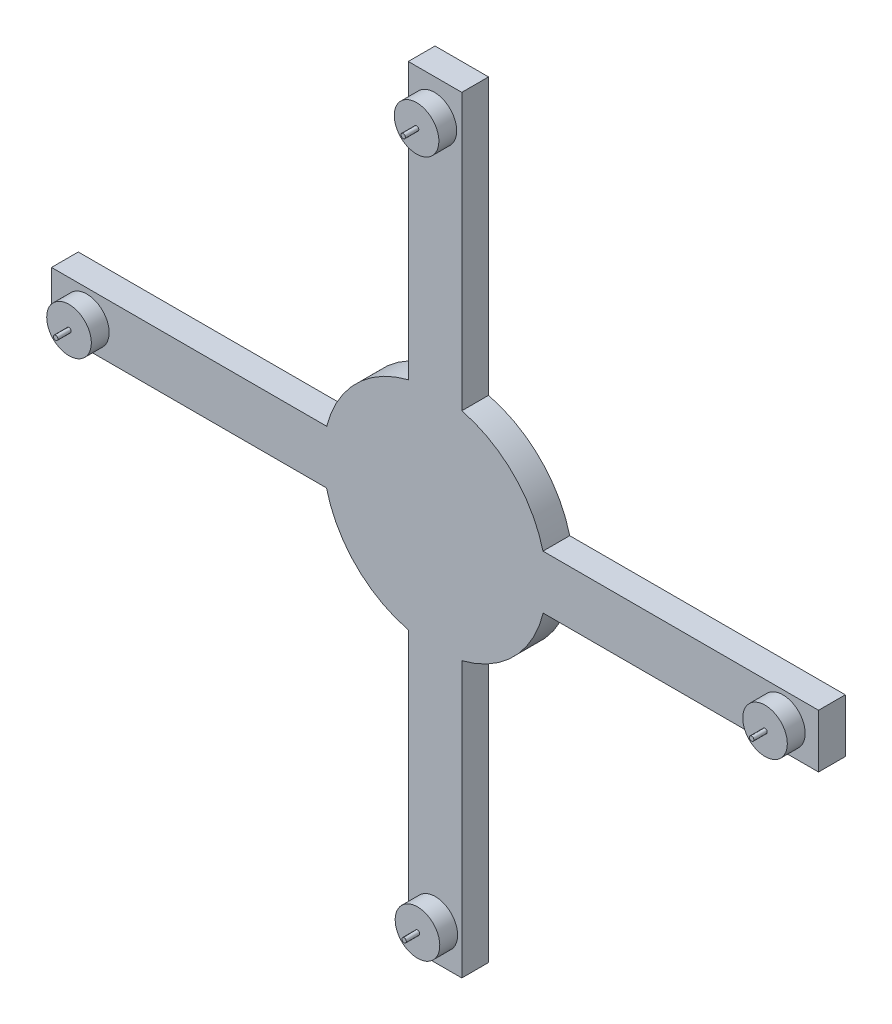
ISO-10303-21;
HEADER;
FILE_DESCRIPTION(('STEP AP214'),'2;1');
FILE_NAME('part.step','',(''),(''),'','','');
FILE_SCHEMA(('AUTOMOTIVE_DESIGN { 1 0 10303 214 1 1 1 1 }'));
ENDSEC;
DATA;
#1=APPLICATION_CONTEXT('core data for automotive mechanical design processes');
#2=APPLICATION_PROTOCOL_DEFINITION('international standard','automotive_design',2000,#1);
#3=PRODUCT_CONTEXT('',#1,'mechanical');
#4=PRODUCT('Part','Part','',(#3));
#5=PRODUCT_RELATED_PRODUCT_CATEGORY('part','',(#4));
#6=PRODUCT_DEFINITION_FORMATION('','',#4);
#7=PRODUCT_DEFINITION_CONTEXT('part definition',#1,'design');
#8=PRODUCT_DEFINITION('design','',#6,#7);
#9=PRODUCT_DEFINITION_SHAPE('','',#8);
#10=(LENGTH_UNIT() NAMED_UNIT(*) SI_UNIT(.MILLI.,.METRE.));
#11=(NAMED_UNIT(*) PLANE_ANGLE_UNIT() SI_UNIT($,.RADIAN.));
#12=(NAMED_UNIT(*) SI_UNIT($,.STERADIAN.) SOLID_ANGLE_UNIT());
#13=UNCERTAINTY_MEASURE_WITH_UNIT(LENGTH_MEASURE(1.E-05),#10,'distance_accuracy_value','');
#14=(GEOMETRIC_REPRESENTATION_CONTEXT(3) GLOBAL_UNCERTAINTY_ASSIGNED_CONTEXT((#13)) GLOBAL_UNIT_ASSIGNED_CONTEXT((#10,
#11,#12)) REPRESENTATION_CONTEXT('',''));
#15=CARTESIAN_POINT('',(0.,0.,0.));
#16=DIRECTION('',(0.,0.,1.));
#17=DIRECTION('',(1.,0.,0.));
#18=AXIS2_PLACEMENT_3D('',#15,#16,#17);
#19=CARTESIAN_POINT('',(-0.207962799947836,-0.516116691663626,-15.));
#20=DIRECTION('',(0.,0.,1.));
#21=DIRECTION('',(1.,0.,0.));
#22=AXIS2_PLACEMENT_3D('',#19,#20,#21);
#23=CYLINDRICAL_SURFACE('',#22,125.);
#24=DIRECTION('',(0.,0.,1.));
#25=VECTOR('',#24,1.);
#26=CARTESIAN_POINT('',(-30.,-121.91395241978,-15.));
#27=LINE('',#26,#25);
#28=CARTESIAN_POINT('',(-30.,-121.91395241978,-15.));
#29=VERTEX_POINT('',#28);
#30=CARTESIAN_POINT('',(-30.,-121.91395241978,15.));
#31=VERTEX_POINT('',#30);
#32=EDGE_CURVE('E38',#29,#31,#27,.T.);
#33=ORIENTED_EDGE('',*,*,#32,.T.);
#34=CARTESIAN_POINT('',(-0.207962799947836,-0.516116691663626,15.));
#35=DIRECTION('',(0.,0.,1.));
#36=DIRECTION('',(1.,0.,0.));
#37=AXIS2_PLACEMENT_3D('',#34,#35,#36);
#38=CIRCLE('',#37,125.);
#39=CARTESIAN_POINT('',(-121.681007649661,-30.,15.));
#40=VERTEX_POINT('',#39);
#41=EDGE_CURVE('E147',#40,#31,#38,.T.);
#42=ORIENTED_EDGE('',*,*,#41,.F.);
#43=DIRECTION('',(0.,0.,1.));
#44=VECTOR('',#43,1.);
#45=CARTESIAN_POINT('',(-121.681007649661,-30.,-15.));
#46=LINE('',#45,#44);
#47=CARTESIAN_POINT('',(-121.681007649661,-30.,-15.));
#48=VERTEX_POINT('',#47);
#49=EDGE_CURVE('E11',#48,#40,#46,.T.);
#50=ORIENTED_EDGE('',*,*,#49,.F.);
#51=CARTESIAN_POINT('',(-0.207962799947836,-0.516116691663626,-15.));
#52=DIRECTION('',(0.,0.,1.));
#53=DIRECTION('',(1.,0.,0.));
#54=AXIS2_PLACEMENT_3D('',#51,#52,#53);
#55=CIRCLE('',#54,125.);
#56=EDGE_CURVE('E149',#48,#29,#55,.T.);
#57=ORIENTED_EDGE('',*,*,#56,.T.);
#58=EDGE_LOOP('',(#33,#42,#50,#57));
#59=FACE_BOUND('',#58,.T.);
#60=ADVANCED_FACE('F35',(#59),#23,.T.);
#61=CARTESIAN_POINT('',(0.,-30.,-15.));
#62=DIRECTION('',(0.,1.,0.));
#63=DIRECTION('',(0.,0.,1.));
#64=AXIS2_PLACEMENT_3D('',#61,#62,#63);
#65=PLANE('',#64);
#66=ORIENTED_EDGE('',*,*,#49,.T.);
#67=DIRECTION('',(-1.,0.,0.));
#68=VECTOR('',#67,1.);
#69=CARTESIAN_POINT('',(0.,-30.,15.));
#70=LINE('',#69,#68);
#71=CARTESIAN_POINT('',(-430.,-30.,15.));
#72=VERTEX_POINT('',#71);
#73=EDGE_CURVE('E162',#40,#72,#70,.T.);
#74=ORIENTED_EDGE('',*,*,#73,.T.);
#75=DIRECTION('',(0.,0.,1.));
#76=VECTOR('',#75,1.);
#77=CARTESIAN_POINT('',(-430.,-30.,-15.));
#78=LINE('',#77,#76);
#79=CARTESIAN_POINT('',(-430.,-30.,-15.));
#80=VERTEX_POINT('',#79);
#81=EDGE_CURVE('E43',#80,#72,#78,.T.);
#82=ORIENTED_EDGE('',*,*,#81,.F.);
#83=DIRECTION('',(-1.,0.,0.));
#84=VECTOR('',#83,1.);
#85=CARTESIAN_POINT('',(0.,-30.,-15.));
#86=LINE('',#85,#84);
#87=EDGE_CURVE('E56',#48,#80,#86,.T.);
#88=ORIENTED_EDGE('',*,*,#87,.F.);
#89=EDGE_LOOP('',(#66,#74,#82,#88));
#90=FACE_BOUND('',#89,.T.);
#91=ADVANCED_FACE('F326',(#90),#65,.F.);
#92=CARTESIAN_POINT('',(-430.,0.,-15.));
#93=DIRECTION('',(1.,0.,0.));
#94=DIRECTION('',(0.,0.,-1.));
#95=AXIS2_PLACEMENT_3D('',#92,#93,#94);
#96=PLANE('',#95);
#97=ORIENTED_EDGE('',*,*,#81,.T.);
#98=DIRECTION('',(0.,1.,0.));
#99=VECTOR('',#98,1.);
#100=CARTESIAN_POINT('',(-430.,0.,15.));
#101=LINE('',#100,#99);
#102=CARTESIAN_POINT('',(-430.,30.,15.));
#103=VERTEX_POINT('',#102);
#104=EDGE_CURVE('E205',#72,#103,#101,.T.);
#105=ORIENTED_EDGE('',*,*,#104,.T.);
#106=DIRECTION('',(0.,0.,1.));
#107=VECTOR('',#106,1.);
#108=CARTESIAN_POINT('',(-430.,30.,-15.));
#109=LINE('',#108,#107);
#110=CARTESIAN_POINT('',(-430.,30.,-15.));
#111=VERTEX_POINT('',#110);
#112=EDGE_CURVE('E243',#111,#103,#109,.T.);
#113=ORIENTED_EDGE('',*,*,#112,.F.);
#114=DIRECTION('',(0.,1.,0.));
#115=VECTOR('',#114,1.);
#116=CARTESIAN_POINT('',(-430.,0.,-15.));
#117=LINE('',#116,#115);
#118=EDGE_CURVE('E239',#80,#111,#117,.T.);
#119=ORIENTED_EDGE('',*,*,#118,.F.);
#120=EDGE_LOOP('',(#97,#105,#113,#119));
#121=FACE_BOUND('',#120,.T.);
#122=ADVANCED_FACE('F324',(#121),#96,.F.);
#123=CARTESIAN_POINT('',(0.,30.,-15.));
#124=DIRECTION('',(0.,-1.,0.));
#125=DIRECTION('',(0.,0.,-1.));
#126=AXIS2_PLACEMENT_3D('',#123,#124,#125);
#127=PLANE('',#126);
#128=ORIENTED_EDGE('',*,*,#112,.T.);
#129=DIRECTION('',(1.,0.,0.));
#130=VECTOR('',#129,1.);
#131=CARTESIAN_POINT('',(0.,30.,15.));
#132=LINE('',#131,#130);
#133=CARTESIAN_POINT('',(-121.425810586735,30.,15.));
#134=VERTEX_POINT('',#133);
#135=EDGE_CURVE('E202',#103,#134,#132,.T.);
#136=ORIENTED_EDGE('',*,*,#135,.T.);
#137=DIRECTION('',(0.,0.,1.));
#138=VECTOR('',#137,1.);
#139=CARTESIAN_POINT('',(-121.425810586735,30.,-15.));
#140=LINE('',#139,#138);
#141=CARTESIAN_POINT('',(-121.425810586735,30.,-15.));
#142=VERTEX_POINT('',#141);
#143=EDGE_CURVE('E245',#142,#134,#140,.T.);
#144=ORIENTED_EDGE('',*,*,#143,.F.);
#145=DIRECTION('',(1.,0.,0.));
#146=VECTOR('',#145,1.);
#147=CARTESIAN_POINT('',(0.,30.,-15.));
#148=LINE('',#147,#146);
#149=EDGE_CURVE('E237',#111,#142,#148,.T.);
#150=ORIENTED_EDGE('',*,*,#149,.F.);
#151=EDGE_LOOP('',(#128,#136,#144,#150));
#152=FACE_BOUND('',#151,.T.);
#153=ADVANCED_FACE('F319',(#152),#127,.F.);
#154=CARTESIAN_POINT('',(-0.207962799947836,-0.516116691663626,-15.));
#155=DIRECTION('',(0.,0.,1.));
#156=DIRECTION('',(1.,0.,0.));
#157=AXIS2_PLACEMENT_3D('',#154,#155,#156);
#158=CYLINDRICAL_SURFACE('',#157,125.);
#159=ORIENTED_EDGE('',*,*,#143,.T.);
#160=CARTESIAN_POINT('',(-0.207962799947836,-0.516116691663626,15.));
#161=DIRECTION('',(0.,0.,1.));
#162=DIRECTION('',(1.,0.,0.));
#163=AXIS2_PLACEMENT_3D('',#160,#161,#162);
#164=CIRCLE('',#163,125.);
#165=CARTESIAN_POINT('',(-30.,120.881719036453,15.));
#166=VERTEX_POINT('',#165);
#167=EDGE_CURVE('E199',#166,#134,#164,.T.);
#168=ORIENTED_EDGE('',*,*,#167,.F.);
#169=DIRECTION('',(0.,0.,1.));
#170=VECTOR('',#169,1.);
#171=CARTESIAN_POINT('',(-30.,120.881719036453,-15.));
#172=LINE('',#171,#170);
#173=CARTESIAN_POINT('',(-30.,120.881719036453,-15.));
#174=VERTEX_POINT('',#173);
#175=EDGE_CURVE('E247',#174,#166,#172,.T.);
#176=ORIENTED_EDGE('',*,*,#175,.F.);
#177=CARTESIAN_POINT('',(-0.207962799947836,-0.516116691663626,-15.));
#178=DIRECTION('',(0.,0.,1.));
#179=DIRECTION('',(1.,0.,0.));
#180=AXIS2_PLACEMENT_3D('',#177,#178,#179);
#181=CIRCLE('',#180,125.);
#182=EDGE_CURVE('E234',#174,#142,#181,.T.);
#183=ORIENTED_EDGE('',*,*,#182,.T.);
#184=EDGE_LOOP('',(#159,#168,#176,#183));
#185=FACE_BOUND('',#184,.T.);
#186=ADVANCED_FACE('F315',(#185),#158,.T.);
#187=CARTESIAN_POINT('',(-30.,0.,-15.));
#188=DIRECTION('',(1.,0.,0.));
#189=DIRECTION('',(0.,0.,-1.));
#190=AXIS2_PLACEMENT_3D('',#187,#188,#189);
#191=PLANE('',#190);
#192=ORIENTED_EDGE('',*,*,#175,.T.);
#193=DIRECTION('',(0.,1.,0.));
#194=VECTOR('',#193,1.);
#195=CARTESIAN_POINT('',(-30.,0.,15.));
#196=LINE('',#195,#194);
#197=CARTESIAN_POINT('',(-30.,430.,15.));
#198=VERTEX_POINT('',#197);
#199=EDGE_CURVE('E196',#166,#198,#196,.T.);
#200=ORIENTED_EDGE('',*,*,#199,.T.);
#201=DIRECTION('',(0.,0.,1.));
#202=VECTOR('',#201,1.);
#203=CARTESIAN_POINT('',(-30.,430.,-15.));
#204=LINE('',#203,#202);
#205=CARTESIAN_POINT('',(-30.,430.,-15.));
#206=VERTEX_POINT('',#205);
#207=EDGE_CURVE('E249',#206,#198,#204,.T.);
#208=ORIENTED_EDGE('',*,*,#207,.F.);
#209=DIRECTION('',(0.,1.,0.));
#210=VECTOR('',#209,1.);
#211=CARTESIAN_POINT('',(-30.,0.,-15.));
#212=LINE('',#211,#210);
#213=EDGE_CURVE('E232',#174,#206,#212,.T.);
#214=ORIENTED_EDGE('',*,*,#213,.F.);
#215=EDGE_LOOP('',(#192,#200,#208,#214));
#216=FACE_BOUND('',#215,.T.);
#217=ADVANCED_FACE('F310',(#216),#191,.F.);
#218=CARTESIAN_POINT('',(0.,430.,-15.));
#219=DIRECTION('',(0.,-1.,0.));
#220=DIRECTION('',(0.,0.,-1.));
#221=AXIS2_PLACEMENT_3D('',#218,#219,#220);
#222=PLANE('',#221);
#223=ORIENTED_EDGE('',*,*,#207,.T.);
#224=DIRECTION('',(1.,0.,0.));
#225=VECTOR('',#224,1.);
#226=CARTESIAN_POINT('',(0.,430.,15.));
#227=LINE('',#226,#225);
#228=CARTESIAN_POINT('',(30.,430.,15.));
#229=VERTEX_POINT('',#228);
#230=EDGE_CURVE('E193',#198,#229,#227,.T.);
#231=ORIENTED_EDGE('',*,*,#230,.T.);
#232=DIRECTION('',(0.,0.,1.));
#233=VECTOR('',#232,1.);
#234=CARTESIAN_POINT('',(30.,430.,-15.));
#235=LINE('',#234,#233);
#236=CARTESIAN_POINT('',(30.,430.,-15.));
#237=VERTEX_POINT('',#236);
#238=EDGE_CURVE('E251',#237,#229,#235,.T.);
#239=ORIENTED_EDGE('',*,*,#238,.F.);
#240=DIRECTION('',(1.,0.,0.));
#241=VECTOR('',#240,1.);
#242=CARTESIAN_POINT('',(0.,430.,-15.));
#243=LINE('',#242,#241);
#244=EDGE_CURVE('E230',#206,#237,#243,.T.);
#245=ORIENTED_EDGE('',*,*,#244,.F.);
#246=EDGE_LOOP('',(#223,#231,#239,#245));
#247=FACE_BOUND('',#246,.T.);
#248=ADVANCED_FACE('F306',(#247),#222,.F.);
#249=CARTESIAN_POINT('',(30.,0.,-15.));
#250=DIRECTION('',(-1.,0.,0.));
#251=DIRECTION('',(0.,0.,1.));
#252=AXIS2_PLACEMENT_3D('',#249,#250,#251);
#253=PLANE('',#252);
#254=ORIENTED_EDGE('',*,*,#238,.T.);
#255=DIRECTION('',(0.,-1.,0.));
#256=VECTOR('',#255,1.);
#257=CARTESIAN_POINT('',(30.,0.,15.));
#258=LINE('',#257,#256);
#259=CARTESIAN_POINT('',(30.,120.778891381534,15.));
#260=VERTEX_POINT('',#259);
#261=EDGE_CURVE('E190',#229,#260,#258,.T.);
#262=ORIENTED_EDGE('',*,*,#261,.T.);
#263=DIRECTION('',(0.,0.,1.));
#264=VECTOR('',#263,1.);
#265=CARTESIAN_POINT('',(30.,120.778891381534,-15.));
#266=LINE('',#265,#264);
#267=CARTESIAN_POINT('',(30.,120.778891381534,-15.));
#268=VERTEX_POINT('',#267);
#269=EDGE_CURVE('E253',#268,#260,#266,.T.);
#270=ORIENTED_EDGE('',*,*,#269,.F.);
#271=DIRECTION('',(0.,-1.,0.));
#272=VECTOR('',#271,1.);
#273=CARTESIAN_POINT('',(30.,0.,-15.));
#274=LINE('',#273,#272);
#275=EDGE_CURVE('E228',#237,#268,#274,.T.);
#276=ORIENTED_EDGE('',*,*,#275,.F.);
#277=EDGE_LOOP('',(#254,#262,#270,#276));
#278=FACE_BOUND('',#277,.T.);
#279=ADVANCED_FACE('F301',(#278),#253,.F.);
#280=CARTESIAN_POINT('',(-0.207962799947836,-0.516116691663626,-15.));
#281=DIRECTION('',(0.,0.,1.));
#282=DIRECTION('',(1.,0.,0.));
#283=AXIS2_PLACEMENT_3D('',#280,#281,#282);
#284=CYLINDRICAL_SURFACE('',#283,125.);
#285=ORIENTED_EDGE('',*,*,#269,.T.);
#286=CARTESIAN_POINT('',(-0.207962799947836,-0.516116691663626,15.));
#287=DIRECTION('',(0.,0.,1.));
#288=DIRECTION('',(1.,0.,0.));
#289=AXIS2_PLACEMENT_3D('',#286,#287,#288);
#290=CIRCLE('',#289,125.);
#291=CARTESIAN_POINT('',(121.00988498684,30.,15.));
#292=VERTEX_POINT('',#291);
#293=EDGE_CURVE('E187',#292,#260,#290,.T.);
#294=ORIENTED_EDGE('',*,*,#293,.F.);
#295=DIRECTION('',(0.,0.,1.));
#296=VECTOR('',#295,1.);
#297=CARTESIAN_POINT('',(121.00988498684,30.,-15.));
#298=LINE('',#297,#296);
#299=CARTESIAN_POINT('',(121.00988498684,30.,-15.));
#300=VERTEX_POINT('',#299);
#301=EDGE_CURVE('E255',#300,#292,#298,.T.);
#302=ORIENTED_EDGE('',*,*,#301,.F.);
#303=CARTESIAN_POINT('',(-0.207962799947836,-0.516116691663626,-15.));
#304=DIRECTION('',(0.,0.,1.));
#305=DIRECTION('',(1.,0.,0.));
#306=AXIS2_PLACEMENT_3D('',#303,#304,#305);
#307=CIRCLE('',#306,125.);
#308=EDGE_CURVE('E225',#300,#268,#307,.T.);
#309=ORIENTED_EDGE('',*,*,#308,.T.);
#310=EDGE_LOOP('',(#285,#294,#302,#309));
#311=FACE_BOUND('',#310,.T.);
#312=ADVANCED_FACE('F296',(#311),#284,.T.);
#313=CARTESIAN_POINT('',(0.,30.,-15.));
#314=DIRECTION('',(0.,-1.,0.));
#315=DIRECTION('',(0.,0.,-1.));
#316=AXIS2_PLACEMENT_3D('',#313,#314,#315);
#317=PLANE('',#316);
#318=ORIENTED_EDGE('',*,*,#301,.T.);
#319=DIRECTION('',(1.,0.,0.));
#320=VECTOR('',#319,1.);
#321=CARTESIAN_POINT('',(0.,30.,15.));
#322=LINE('',#321,#320);
#323=CARTESIAN_POINT('',(430.,30.,15.));
#324=VERTEX_POINT('',#323);
#325=EDGE_CURVE('E184',#292,#324,#322,.T.);
#326=ORIENTED_EDGE('',*,*,#325,.T.);
#327=DIRECTION('',(0.,0.,1.));
#328=VECTOR('',#327,1.);
#329=CARTESIAN_POINT('',(430.,30.,-15.));
#330=LINE('',#329,#328);
#331=CARTESIAN_POINT('',(430.,30.,-15.));
#332=VERTEX_POINT('',#331);
#333=EDGE_CURVE('E257',#332,#324,#330,.T.);
#334=ORIENTED_EDGE('',*,*,#333,.F.);
#335=DIRECTION('',(1.,0.,0.));
#336=VECTOR('',#335,1.);
#337=CARTESIAN_POINT('',(0.,30.,-15.));
#338=LINE('',#337,#336);
#339=EDGE_CURVE('E223',#300,#332,#338,.T.);
#340=ORIENTED_EDGE('',*,*,#339,.F.);
#341=EDGE_LOOP('',(#318,#326,#334,#340));
#342=FACE_BOUND('',#341,.T.);
#343=ADVANCED_FACE('F291',(#342),#317,.F.);
#344=CARTESIAN_POINT('',(430.,0.,-15.));
#345=DIRECTION('',(-1.,0.,0.));
#346=DIRECTION('',(0.,0.,1.));
#347=AXIS2_PLACEMENT_3D('',#344,#345,#346);
#348=PLANE('',#347);
#349=ORIENTED_EDGE('',*,*,#333,.T.);
#350=DIRECTION('',(0.,-1.,0.));
#351=VECTOR('',#350,1.);
#352=CARTESIAN_POINT('',(430.,0.,15.));
#353=LINE('',#352,#351);
#354=CARTESIAN_POINT('',(430.,-30.,15.));
#355=VERTEX_POINT('',#354);
#356=EDGE_CURVE('E181',#324,#355,#353,.T.);
#357=ORIENTED_EDGE('',*,*,#356,.T.);
#358=DIRECTION('',(0.,0.,1.));
#359=VECTOR('',#358,1.);
#360=CARTESIAN_POINT('',(430.,-30.,-15.));
#361=LINE('',#360,#359);
#362=CARTESIAN_POINT('',(430.,-30.,-15.));
#363=VERTEX_POINT('',#362);
#364=EDGE_CURVE('E259',#363,#355,#361,.T.);
#365=ORIENTED_EDGE('',*,*,#364,.F.);
#366=DIRECTION('',(0.,-1.,0.));
#367=VECTOR('',#366,1.);
#368=CARTESIAN_POINT('',(430.,0.,-15.));
#369=LINE('',#368,#367);
#370=EDGE_CURVE('E221',#332,#363,#369,.T.);
#371=ORIENTED_EDGE('',*,*,#370,.F.);
#372=EDGE_LOOP('',(#349,#357,#365,#371));
#373=FACE_BOUND('',#372,.T.);
#374=ADVANCED_FACE('F287',(#373),#348,.F.);
#375=CARTESIAN_POINT('',(0.,-30.,-15.));
#376=DIRECTION('',(0.,1.,0.));
#377=DIRECTION('',(0.,0.,1.));
#378=AXIS2_PLACEMENT_3D('',#375,#376,#377);
#379=PLANE('',#378);
#380=ORIENTED_EDGE('',*,*,#364,.T.);
#381=DIRECTION('',(-1.,0.,0.));
#382=VECTOR('',#381,1.);
#383=CARTESIAN_POINT('',(0.,-30.,15.));
#384=LINE('',#383,#382);
#385=CARTESIAN_POINT('',(121.265082049765,-30.,15.));
#386=VERTEX_POINT('',#385);
#387=EDGE_CURVE('E178',#355,#386,#384,.T.);
#388=ORIENTED_EDGE('',*,*,#387,.T.);
#389=DIRECTION('',(0.,0.,1.));
#390=VECTOR('',#389,1.);
#391=CARTESIAN_POINT('',(121.265082049765,-30.,-15.));
#392=LINE('',#391,#390);
#393=CARTESIAN_POINT('',(121.265082049765,-30.,-15.));
#394=VERTEX_POINT('',#393);
#395=EDGE_CURVE('E261',#394,#386,#392,.T.);
#396=ORIENTED_EDGE('',*,*,#395,.F.);
#397=DIRECTION('',(-1.,0.,0.));
#398=VECTOR('',#397,1.);
#399=CARTESIAN_POINT('',(0.,-30.,-15.));
#400=LINE('',#399,#398);
#401=EDGE_CURVE('E219',#363,#394,#400,.T.);
#402=ORIENTED_EDGE('',*,*,#401,.F.);
#403=EDGE_LOOP('',(#380,#388,#396,#402));
#404=FACE_BOUND('',#403,.T.);
#405=ADVANCED_FACE('F282',(#404),#379,.F.);
#406=CARTESIAN_POINT('',(-0.207962799947836,-0.516116691663626,-15.));
#407=DIRECTION('',(0.,0.,1.));
#408=DIRECTION('',(1.,0.,0.));
#409=AXIS2_PLACEMENT_3D('',#406,#407,#408);
#410=CYLINDRICAL_SURFACE('',#409,125.);
#411=ORIENTED_EDGE('',*,*,#395,.T.);
#412=CARTESIAN_POINT('',(-0.207962799947836,-0.516116691663626,15.));
#413=DIRECTION('',(0.,0.,1.));
#414=DIRECTION('',(1.,0.,0.));
#415=AXIS2_PLACEMENT_3D('',#412,#413,#414);
#416=CIRCLE('',#415,125.);
#417=CARTESIAN_POINT('',(30.,-121.811124764861,15.));
#418=VERTEX_POINT('',#417);
#419=EDGE_CURVE('E175',#418,#386,#416,.T.);
#420=ORIENTED_EDGE('',*,*,#419,.F.);
#421=DIRECTION('',(0.,0.,1.));
#422=VECTOR('',#421,1.);
#423=CARTESIAN_POINT('',(30.,-121.811124764861,-15.));
#424=LINE('',#423,#422);
#425=CARTESIAN_POINT('',(30.,-121.811124764861,-15.));
#426=VERTEX_POINT('',#425);
#427=EDGE_CURVE('E263',#426,#418,#424,.T.);
#428=ORIENTED_EDGE('',*,*,#427,.F.);
#429=CARTESIAN_POINT('',(-0.207962799947836,-0.516116691663626,-15.));
#430=DIRECTION('',(0.,0.,1.));
#431=DIRECTION('',(1.,0.,0.));
#432=AXIS2_PLACEMENT_3D('',#429,#430,#431);
#433=CIRCLE('',#432,125.);
#434=EDGE_CURVE('E216',#426,#394,#433,.T.);
#435=ORIENTED_EDGE('',*,*,#434,.T.);
#436=EDGE_LOOP('',(#411,#420,#428,#435));
#437=FACE_BOUND('',#436,.T.);
#438=ADVANCED_FACE('F277',(#437),#410,.T.);
#439=CARTESIAN_POINT('',(30.,0.,-15.));
#440=DIRECTION('',(-1.,0.,0.));
#441=DIRECTION('',(0.,0.,1.));
#442=AXIS2_PLACEMENT_3D('',#439,#440,#441);
#443=PLANE('',#442);
#444=ORIENTED_EDGE('',*,*,#427,.T.);
#445=DIRECTION('',(0.,-1.,0.));
#446=VECTOR('',#445,1.);
#447=CARTESIAN_POINT('',(30.,0.,15.));
#448=LINE('',#447,#446);
#449=CARTESIAN_POINT('',(30.,-430.,15.));
#450=VERTEX_POINT('',#449);
#451=EDGE_CURVE('E169',#418,#450,#448,.T.);
#452=ORIENTED_EDGE('',*,*,#451,.T.);
#453=DIRECTION('',(0.,0.,1.));
#454=VECTOR('',#453,1.);
#455=CARTESIAN_POINT('',(30.,-430.,-15.));
#456=LINE('',#455,#454);
#457=CARTESIAN_POINT('',(30.,-430.,-15.));
#458=VERTEX_POINT('',#457);
#459=EDGE_CURVE('E265',#458,#450,#456,.T.);
#460=ORIENTED_EDGE('',*,*,#459,.F.);
#461=DIRECTION('',(0.,-1.,0.));
#462=VECTOR('',#461,1.);
#463=CARTESIAN_POINT('',(30.,0.,-15.));
#464=LINE('',#463,#462);
#465=EDGE_CURVE('E214',#426,#458,#464,.T.);
#466=ORIENTED_EDGE('',*,*,#465,.F.);
#467=EDGE_LOOP('',(#444,#452,#460,#466));
#468=FACE_BOUND('',#467,.T.);
#469=ADVANCED_FACE('F273',(#468),#443,.F.);
#470=CARTESIAN_POINT('',(0.,-430.,-15.));
#471=DIRECTION('',(0.,1.,0.));
#472=DIRECTION('',(0.,0.,1.));
#473=AXIS2_PLACEMENT_3D('',#470,#471,#472);
#474=PLANE('',#473);
#475=ORIENTED_EDGE('',*,*,#459,.T.);
#476=DIRECTION('',(-1.,0.,0.));
#477=VECTOR('',#476,1.);
#478=CARTESIAN_POINT('',(0.,-430.,15.));
#479=LINE('',#478,#477);
#480=CARTESIAN_POINT('',(-30.,-430.,15.));
#481=VERTEX_POINT('',#480);
#482=EDGE_CURVE('E167',#450,#481,#479,.T.);
#483=ORIENTED_EDGE('',*,*,#482,.T.);
#484=DIRECTION('',(0.,0.,1.));
#485=VECTOR('',#484,1.);
#486=CARTESIAN_POINT('',(-30.,-430.,-15.));
#487=LINE('',#486,#485);
#488=CARTESIAN_POINT('',(-30.,-430.,-15.));
#489=VERTEX_POINT('',#488);
#490=EDGE_CURVE('E153',#489,#481,#487,.T.);
#491=ORIENTED_EDGE('',*,*,#490,.F.);
#492=DIRECTION('',(-1.,0.,0.));
#493=VECTOR('',#492,1.);
#494=CARTESIAN_POINT('',(0.,-430.,-15.));
#495=LINE('',#494,#493);
#496=EDGE_CURVE('E212',#458,#489,#495,.T.);
#497=ORIENTED_EDGE('',*,*,#496,.F.);
#498=EDGE_LOOP('',(#475,#483,#491,#497));
#499=FACE_BOUND('',#498,.T.);
#500=ADVANCED_FACE('F269',(#499),#474,.F.);
#501=CARTESIAN_POINT('',(-30.,0.,-15.));
#502=DIRECTION('',(1.,0.,0.));
#503=DIRECTION('',(0.,0.,-1.));
#504=AXIS2_PLACEMENT_3D('',#501,#502,#503);
#505=PLANE('',#504);
#506=ORIENTED_EDGE('',*,*,#490,.T.);
#507=DIRECTION('',(0.,1.,0.));
#508=VECTOR('',#507,1.);
#509=CARTESIAN_POINT('',(-30.,0.,15.));
#510=LINE('',#509,#508);
#511=EDGE_CURVE('E158',#481,#31,#510,.T.);
#512=ORIENTED_EDGE('',*,*,#511,.T.);
#513=ORIENTED_EDGE('',*,*,#32,.F.);
#514=DIRECTION('',(0.,1.,0.));
#515=VECTOR('',#514,1.);
#516=CARTESIAN_POINT('',(-30.,0.,-15.));
#517=LINE('',#516,#515);
#518=EDGE_CURVE('E210',#489,#29,#517,.T.);
#519=ORIENTED_EDGE('',*,*,#518,.F.);
#520=EDGE_LOOP('',(#506,#512,#513,#519));
#521=FACE_BOUND('',#520,.T.);
#522=ADVANCED_FACE('F165',(#521),#505,.F.);
#523=CARTESIAN_POINT('',(0.,0.,-15.));
#524=DIRECTION('',(0.,0.,1.));
#525=DIRECTION('',(1.,0.,0.));
#526=AXIS2_PLACEMENT_3D('',#523,#524,#525);
#527=PLANE('',#526);
#528=ORIENTED_EDGE('',*,*,#56,.F.);
#529=ORIENTED_EDGE('',*,*,#87,.T.);
#530=ORIENTED_EDGE('',*,*,#118,.T.);
#531=ORIENTED_EDGE('',*,*,#149,.T.);
#532=ORIENTED_EDGE('',*,*,#182,.F.);
#533=ORIENTED_EDGE('',*,*,#213,.T.);
#534=ORIENTED_EDGE('',*,*,#244,.T.);
#535=ORIENTED_EDGE('',*,*,#275,.T.);
#536=ORIENTED_EDGE('',*,*,#308,.F.);
#537=ORIENTED_EDGE('',*,*,#339,.T.);
#538=ORIENTED_EDGE('',*,*,#370,.T.);
#539=ORIENTED_EDGE('',*,*,#401,.T.);
#540=ORIENTED_EDGE('',*,*,#434,.F.);
#541=ORIENTED_EDGE('',*,*,#465,.T.);
#542=ORIENTED_EDGE('',*,*,#496,.T.);
#543=ORIENTED_EDGE('',*,*,#518,.T.);
#544=EDGE_LOOP('',(#528,#529,#530,#531,#532,#533,#534,#535,#536,#537,#538,#539,#540,#541,#542,#543));
#545=FACE_BOUND('',#544,.T.);
#546=ADVANCED_FACE('F327',(#545),#527,.F.);
#547=CARTESIAN_POINT('',(0.,0.,15.));
#548=DIRECTION('',(0.,0.,1.));
#549=DIRECTION('',(1.,0.,0.));
#550=AXIS2_PLACEMENT_3D('',#547,#548,#549);
#551=PLANE('',#550);
#552=CARTESIAN_POINT('',(0.308153891719877,-390.724079491612,15.));
#553=DIRECTION('',(0.,0.,1.));
#554=DIRECTION('',(0.,-1.,0.));
#555=AXIS2_PLACEMENT_3D('',#552,#553,#554);
#556=CIRCLE('',#555,25.);
#557=CARTESIAN_POINT('',(0.308153891720139,-415.724079491612,15.));
#558=VERTEX_POINT('',#557);
#559=EDGE_CURVE('E573',#558,#558,#556,.T.);
#560=ORIENTED_EDGE('',*,*,#559,.F.);
#561=EDGE_LOOP('',(#560));
#562=FACE_BOUND('',#561,.T.);
#563=CARTESIAN_POINT('',(-390.415925599896,-1.03223338332725,15.));
#564=DIRECTION('',(0.,0.,1.));
#565=DIRECTION('',(-1.,0.,0.));
#566=AXIS2_PLACEMENT_3D('',#563,#564,#565);
#567=CIRCLE('',#566,25.);
#568=CARTESIAN_POINT('',(-415.415925599896,-1.03223338332725,15.));
#569=VERTEX_POINT('',#568);
#570=EDGE_CURVE('E579',#569,#569,#567,.T.);
#571=ORIENTED_EDGE('',*,*,#570,.F.);
#572=EDGE_LOOP('',(#571));
#573=FACE_BOUND('',#572,.T.);
#574=CARTESIAN_POINT('',(-0.724079491612825,389.691846108284,15.));
#575=DIRECTION('',(0.,0.,1.));
#576=DIRECTION('',(0.,1.,0.));
#577=AXIS2_PLACEMENT_3D('',#574,#575,#576);
#578=CIRCLE('',#577,25.);
#579=CARTESIAN_POINT('',(-0.724079491612912,414.691846108284,15.));
#580=VERTEX_POINT('',#579);
#581=EDGE_CURVE('E585',#580,#580,#578,.T.);
#582=ORIENTED_EDGE('',*,*,#581,.F.);
#583=EDGE_LOOP('',(#582));
#584=FACE_BOUND('',#583,.T.);
#585=CARTESIAN_POINT('',(390.,0.,15.));
#586=DIRECTION('',(0.,0.,1.));
#587=DIRECTION('',(1.,0.,0.));
#588=AXIS2_PLACEMENT_3D('',#585,#586,#587);
#589=CIRCLE('',#588,25.);
#590=CARTESIAN_POINT('',(415.,0.,15.));
#591=VERTEX_POINT('',#590);
#592=EDGE_CURVE('E597',#591,#591,#589,.T.);
#593=ORIENTED_EDGE('',*,*,#592,.F.);
#594=EDGE_LOOP('',(#593));
#595=FACE_BOUND('',#594,.T.);
#596=ORIENTED_EDGE('',*,*,#41,.T.);
#597=ORIENTED_EDGE('',*,*,#511,.F.);
#598=ORIENTED_EDGE('',*,*,#482,.F.);
#599=ORIENTED_EDGE('',*,*,#451,.F.);
#600=ORIENTED_EDGE('',*,*,#419,.T.);
#601=ORIENTED_EDGE('',*,*,#387,.F.);
#602=ORIENTED_EDGE('',*,*,#356,.F.);
#603=ORIENTED_EDGE('',*,*,#325,.F.);
#604=ORIENTED_EDGE('',*,*,#293,.T.);
#605=ORIENTED_EDGE('',*,*,#261,.F.);
#606=ORIENTED_EDGE('',*,*,#230,.F.);
#607=ORIENTED_EDGE('',*,*,#199,.F.);
#608=ORIENTED_EDGE('',*,*,#167,.T.);
#609=ORIENTED_EDGE('',*,*,#135,.F.);
#610=ORIENTED_EDGE('',*,*,#104,.F.);
#611=ORIENTED_EDGE('',*,*,#73,.F.);
#612=EDGE_LOOP('',(#596,#597,#598,#599,#600,#601,#602,#603,#604,#605,#606,#607,#608,#609,#610,#611));
#613=FACE_BOUND('',#612,.T.);
#614=ADVANCED_FACE('F156',(#562,#573,#584,#595,#613),#551,.T.);
#615=CARTESIAN_POINT('',(390.,0.,35.));
#616=DIRECTION('',(0.,0.,-1.));
#617=DIRECTION('',(-1.,0.,0.));
#618=AXIS2_PLACEMENT_3D('',#615,#616,#617);
#619=CYLINDRICAL_SURFACE('',#618,25.);
#620=CARTESIAN_POINT('',(390.,0.,35.));
#621=DIRECTION('',(0.,0.,1.));
#622=DIRECTION('',(1.,0.,0.));
#623=AXIS2_PLACEMENT_3D('',#620,#621,#622);
#624=CIRCLE('',#623,25.);
#625=CARTESIAN_POINT('',(415.,0.,35.));
#626=VERTEX_POINT('',#625);
#627=EDGE_CURVE('E163',#626,#626,#624,.T.);
#628=ORIENTED_EDGE('',*,*,#627,.F.);
#629=EDGE_LOOP('',(#628));
#630=FACE_BOUND('',#629,.T.);
#631=ORIENTED_EDGE('',*,*,#592,.T.);
#632=EDGE_LOOP('',(#631));
#633=FACE_BOUND('',#632,.T.);
#634=ADVANCED_FACE('F334',(#630,#633),#619,.T.);
#635=CARTESIAN_POINT('',(390.,0.,35.));
#636=DIRECTION('',(0.,0.,1.));
#637=DIRECTION('',(1.,0.,0.));
#638=AXIS2_PLACEMENT_3D('',#635,#636,#637);
#639=PLANE('',#638);
#640=CARTESIAN_POINT('',(390.,0.,35.));
#641=DIRECTION('',(0.,0.,1.));
#642=DIRECTION('',(1.,0.,0.));
#643=AXIS2_PLACEMENT_3D('',#640,#641,#642);
#644=CIRCLE('',#643,2.50000000000002);
#645=CARTESIAN_POINT('',(392.5,0.,35.));
#646=VERTEX_POINT('',#645);
#647=EDGE_CURVE('E591',#646,#646,#644,.T.);
#648=ORIENTED_EDGE('',*,*,#647,.F.);
#649=EDGE_LOOP('',(#648));
#650=FACE_BOUND('',#649,.T.);
#651=ORIENTED_EDGE('',*,*,#627,.T.);
#652=EDGE_LOOP('',(#651));
#653=FACE_BOUND('',#652,.T.);
#654=ADVANCED_FACE('F394',(#650,#653),#639,.T.);
#655=CARTESIAN_POINT('',(390.,0.,50.));
#656=DIRECTION('',(0.,0.,-1.));
#657=DIRECTION('',(-1.,0.,0.));
#658=AXIS2_PLACEMENT_3D('',#655,#656,#657);
#659=CYLINDRICAL_SURFACE('',#658,2.50000000000002);
#660=CARTESIAN_POINT('',(390.,0.,50.));
#661=DIRECTION('',(0.,0.,1.));
#662=DIRECTION('',(1.,0.,0.));
#663=AXIS2_PLACEMENT_3D('',#660,#661,#662);
#664=CIRCLE('',#663,2.50000000000002);
#665=CARTESIAN_POINT('',(392.5,0.,50.));
#666=VERTEX_POINT('',#665);
#667=EDGE_CURVE('E594',#666,#666,#664,.T.);
#668=ORIENTED_EDGE('',*,*,#667,.F.);
#669=EDGE_LOOP('',(#668));
#670=FACE_BOUND('',#669,.T.);
#671=ORIENTED_EDGE('',*,*,#647,.T.);
#672=EDGE_LOOP('',(#671));
#673=FACE_BOUND('',#672,.T.);
#674=ADVANCED_FACE('F405',(#670,#673),#659,.T.);
#675=CARTESIAN_POINT('',(390.,0.,50.));
#676=DIRECTION('',(0.,0.,1.));
#677=DIRECTION('',(1.,0.,0.));
#678=AXIS2_PLACEMENT_3D('',#675,#676,#677);
#679=PLANE('',#678);
#680=ORIENTED_EDGE('',*,*,#667,.T.);
#681=EDGE_LOOP('',(#680));
#682=FACE_BOUND('',#681,.T.);
#683=ADVANCED_FACE('F415',(#682),#679,.T.);
#684=CARTESIAN_POINT('',(-0.724079491612825,389.691846108284,35.));
#685=DIRECTION('',(0.,0.,-1.));
#686=DIRECTION('',(-1.,0.,0.));
#687=AXIS2_PLACEMENT_3D('',#684,#685,#686);
#688=CYLINDRICAL_SURFACE('',#687,25.);
#689=CARTESIAN_POINT('',(-0.724079491612825,389.691846108284,35.));
#690=DIRECTION('',(0.,0.,1.));
#691=DIRECTION('',(0.,1.,0.));
#692=AXIS2_PLACEMENT_3D('',#689,#690,#691);
#693=CIRCLE('',#692,25.);
#694=CARTESIAN_POINT('',(-0.724079491612912,414.691846108284,35.));
#695=VERTEX_POINT('',#694);
#696=EDGE_CURVE('E588',#695,#695,#693,.T.);
#697=ORIENTED_EDGE('',*,*,#696,.F.);
#698=EDGE_LOOP('',(#697));
#699=FACE_BOUND('',#698,.T.);
#700=ORIENTED_EDGE('',*,*,#581,.T.);
#701=EDGE_LOOP('',(#700));
#702=FACE_BOUND('',#701,.T.);
#703=ADVANCED_FACE('F425',(#699,#702),#688,.T.);
#704=CARTESIAN_POINT('',(-0.724079491612825,389.691846108284,35.));
#705=DIRECTION('',(0.,0.,1.));
#706=DIRECTION('',(0.,1.,0.));
#707=AXIS2_PLACEMENT_3D('',#704,#705,#706);
#708=PLANE('',#707);
#709=CARTESIAN_POINT('',(-0.724079491612825,389.691846108284,35.));
#710=DIRECTION('',(0.,0.,1.));
#711=DIRECTION('',(0.,1.,0.));
#712=AXIS2_PLACEMENT_3D('',#709,#710,#711);
#713=CIRCLE('',#712,2.50000000000002);
#714=CARTESIAN_POINT('',(-0.724079491612834,392.191846108284,35.));
#715=VERTEX_POINT('',#714);
#716=EDGE_CURVE('E568',#715,#715,#713,.T.);
#717=ORIENTED_EDGE('',*,*,#716,.F.);
#718=EDGE_LOOP('',(#717));
#719=FACE_BOUND('',#718,.T.);
#720=ORIENTED_EDGE('',*,*,#696,.T.);
#721=EDGE_LOOP('',(#720));
#722=FACE_BOUND('',#721,.T.);
#723=ADVANCED_FACE('F441',(#719,#722),#708,.T.);
#724=CARTESIAN_POINT('',(-390.415925599896,-1.03223338332725,35.));
#725=DIRECTION('',(0.,0.,-1.));
#726=DIRECTION('',(-1.,0.,0.));
#727=AXIS2_PLACEMENT_3D('',#724,#725,#726);
#728=CYLINDRICAL_SURFACE('',#727,25.);
#729=CARTESIAN_POINT('',(-390.415925599896,-1.03223338332725,35.));
#730=DIRECTION('',(0.,0.,1.));
#731=DIRECTION('',(-1.,0.,0.));
#732=AXIS2_PLACEMENT_3D('',#729,#730,#731);
#733=CIRCLE('',#732,25.);
#734=CARTESIAN_POINT('',(-415.415925599896,-1.03223338332725,35.));
#735=VERTEX_POINT('',#734);
#736=EDGE_CURVE('E582',#735,#735,#733,.T.);
#737=ORIENTED_EDGE('',*,*,#736,.F.);
#738=EDGE_LOOP('',(#737));
#739=FACE_BOUND('',#738,.T.);
#740=ORIENTED_EDGE('',*,*,#570,.T.);
#741=EDGE_LOOP('',(#740));
#742=FACE_BOUND('',#741,.T.);
#743=ADVANCED_FACE('F451',(#739,#742),#728,.T.);
#744=CARTESIAN_POINT('',(-390.415925599896,-1.03223338332725,35.));
#745=DIRECTION('',(0.,0.,1.));
#746=DIRECTION('',(-1.,0.,0.));
#747=AXIS2_PLACEMENT_3D('',#744,#745,#746);
#748=PLANE('',#747);
#749=CARTESIAN_POINT('',(-390.415925599896,-1.03223338332725,35.));
#750=DIRECTION('',(0.,0.,1.));
#751=DIRECTION('',(-1.,0.,0.));
#752=AXIS2_PLACEMENT_3D('',#749,#750,#751);
#753=CIRCLE('',#752,2.50000000000002);
#754=CARTESIAN_POINT('',(-392.915925599896,-1.03223338332725,35.));
#755=VERTEX_POINT('',#754);
#756=EDGE_CURVE('E558',#755,#755,#753,.T.);
#757=ORIENTED_EDGE('',*,*,#756,.F.);
#758=EDGE_LOOP('',(#757));
#759=FACE_BOUND('',#758,.T.);
#760=ORIENTED_EDGE('',*,*,#736,.T.);
#761=EDGE_LOOP('',(#760));
#762=FACE_BOUND('',#761,.T.);
#763=ADVANCED_FACE('F461',(#759,#762),#748,.T.);
#764=CARTESIAN_POINT('',(0.308153891719877,-390.724079491612,35.));
#765=DIRECTION('',(0.,0.,-1.));
#766=DIRECTION('',(-1.,0.,0.));
#767=AXIS2_PLACEMENT_3D('',#764,#765,#766);
#768=CYLINDRICAL_SURFACE('',#767,25.);
#769=CARTESIAN_POINT('',(0.308153891719877,-390.724079491612,35.));
#770=DIRECTION('',(0.,0.,1.));
#771=DIRECTION('',(0.,-1.,0.));
#772=AXIS2_PLACEMENT_3D('',#769,#770,#771);
#773=CIRCLE('',#772,25.);
#774=CARTESIAN_POINT('',(0.308153891720139,-415.724079491612,35.));
#775=VERTEX_POINT('',#774);
#776=EDGE_CURVE('E576',#775,#775,#773,.T.);
#777=ORIENTED_EDGE('',*,*,#776,.F.);
#778=EDGE_LOOP('',(#777));
#779=FACE_BOUND('',#778,.T.);
#780=ORIENTED_EDGE('',*,*,#559,.T.);
#781=EDGE_LOOP('',(#780));
#782=FACE_BOUND('',#781,.T.);
#783=ADVANCED_FACE('F471',(#779,#782),#768,.T.);
#784=CARTESIAN_POINT('',(0.308153891719877,-390.724079491612,35.));
#785=DIRECTION('',(0.,0.,1.));
#786=DIRECTION('',(0.,-1.,0.));
#787=AXIS2_PLACEMENT_3D('',#784,#785,#786);
#788=PLANE('',#787);
#789=CARTESIAN_POINT('',(0.308153891719877,-390.724079491612,35.));
#790=DIRECTION('',(0.,0.,1.));
#791=DIRECTION('',(0.,-1.,0.));
#792=AXIS2_PLACEMENT_3D('',#789,#790,#791);
#793=CIRCLE('',#792,2.50000000000002);
#794=CARTESIAN_POINT('',(0.308153891719903,-393.224079491612,35.));
#795=VERTEX_POINT('',#794);
#796=EDGE_CURVE('E559',#795,#795,#793,.T.);
#797=ORIENTED_EDGE('',*,*,#796,.F.);
#798=EDGE_LOOP('',(#797));
#799=FACE_BOUND('',#798,.T.);
#800=ORIENTED_EDGE('',*,*,#776,.T.);
#801=EDGE_LOOP('',(#800));
#802=FACE_BOUND('',#801,.T.);
#803=ADVANCED_FACE('F481',(#799,#802),#788,.T.);
#804=CARTESIAN_POINT('',(-0.724079491612825,389.691846108284,50.));
#805=DIRECTION('',(0.,0.,-1.));
#806=DIRECTION('',(-1.,0.,0.));
#807=AXIS2_PLACEMENT_3D('',#804,#805,#806);
#808=CYLINDRICAL_SURFACE('',#807,2.50000000000002);
#809=CARTESIAN_POINT('',(-0.724079491612825,389.691846108284,50.));
#810=DIRECTION('',(0.,0.,1.));
#811=DIRECTION('',(0.,1.,0.));
#812=AXIS2_PLACEMENT_3D('',#809,#810,#811);
#813=CIRCLE('',#812,2.50000000000002);
#814=CARTESIAN_POINT('',(-0.724079491612834,392.191846108284,50.));
#815=VERTEX_POINT('',#814);
#816=EDGE_CURVE('E570',#815,#815,#813,.T.);
#817=ORIENTED_EDGE('',*,*,#816,.F.);
#818=EDGE_LOOP('',(#817));
#819=FACE_BOUND('',#818,.T.);
#820=ORIENTED_EDGE('',*,*,#716,.T.);
#821=EDGE_LOOP('',(#820));
#822=FACE_BOUND('',#821,.T.);
#823=ADVANCED_FACE('F491',(#819,#822),#808,.T.);
#824=CARTESIAN_POINT('',(-0.724079491612825,389.691846108284,50.));
#825=DIRECTION('',(0.,0.,1.));
#826=DIRECTION('',(0.,1.,0.));
#827=AXIS2_PLACEMENT_3D('',#824,#825,#826);
#828=PLANE('',#827);
#829=ORIENTED_EDGE('',*,*,#816,.T.);
#830=EDGE_LOOP('',(#829));
#831=FACE_BOUND('',#830,.T.);
#832=ADVANCED_FACE('F501',(#831),#828,.T.);
#833=CARTESIAN_POINT('',(-390.415925599896,-1.03223338332725,50.));
#834=DIRECTION('',(0.,0.,-1.));
#835=DIRECTION('',(-1.,0.,0.));
#836=AXIS2_PLACEMENT_3D('',#833,#834,#835);
#837=CYLINDRICAL_SURFACE('',#836,2.50000000000002);
#838=CARTESIAN_POINT('',(-390.415925599896,-1.03223338332725,50.));
#839=DIRECTION('',(0.,0.,1.));
#840=DIRECTION('',(-1.,0.,0.));
#841=AXIS2_PLACEMENT_3D('',#838,#839,#840);
#842=CIRCLE('',#841,2.50000000000002);
#843=CARTESIAN_POINT('',(-392.915925599896,-1.03223338332725,50.));
#844=VERTEX_POINT('',#843);
#845=EDGE_CURVE('E562',#844,#844,#842,.T.);
#846=ORIENTED_EDGE('',*,*,#845,.F.);
#847=EDGE_LOOP('',(#846));
#848=FACE_BOUND('',#847,.T.);
#849=ORIENTED_EDGE('',*,*,#756,.T.);
#850=EDGE_LOOP('',(#849));
#851=FACE_BOUND('',#850,.T.);
#852=ADVANCED_FACE('F511',(#848,#851),#837,.T.);
#853=CARTESIAN_POINT('',(-390.415925599896,-1.03223338332725,50.));
#854=DIRECTION('',(0.,0.,1.));
#855=DIRECTION('',(-1.,0.,0.));
#856=AXIS2_PLACEMENT_3D('',#853,#854,#855);
#857=PLANE('',#856);
#858=ORIENTED_EDGE('',*,*,#845,.T.);
#859=EDGE_LOOP('',(#858));
#860=FACE_BOUND('',#859,.T.);
#861=ADVANCED_FACE('F521',(#860),#857,.T.);
#862=CARTESIAN_POINT('',(0.308153891719877,-390.724079491612,50.));
#863=DIRECTION('',(0.,0.,-1.));
#864=DIRECTION('',(-1.,0.,0.));
#865=AXIS2_PLACEMENT_3D('',#862,#863,#864);
#866=CYLINDRICAL_SURFACE('',#865,2.50000000000002);
#867=CARTESIAN_POINT('',(0.308153891719877,-390.724079491612,50.));
#868=DIRECTION('',(0.,0.,1.));
#869=DIRECTION('',(0.,-1.,0.));
#870=AXIS2_PLACEMENT_3D('',#867,#868,#869);
#871=CIRCLE('',#870,2.50000000000002);
#872=CARTESIAN_POINT('',(0.308153891719903,-393.224079491612,50.));
#873=VERTEX_POINT('',#872);
#874=EDGE_CURVE('E557',#873,#873,#871,.T.);
#875=ORIENTED_EDGE('',*,*,#874,.F.);
#876=EDGE_LOOP('',(#875));
#877=FACE_BOUND('',#876,.T.);
#878=ORIENTED_EDGE('',*,*,#796,.T.);
#879=EDGE_LOOP('',(#878));
#880=FACE_BOUND('',#879,.T.);
#881=ADVANCED_FACE('F531',(#877,#880),#866,.T.);
#882=CARTESIAN_POINT('',(0.308153891719877,-390.724079491612,50.));
#883=DIRECTION('',(0.,0.,1.));
#884=DIRECTION('',(0.,-1.,0.));
#885=AXIS2_PLACEMENT_3D('',#882,#883,#884);
#886=PLANE('',#885);
#887=ORIENTED_EDGE('',*,*,#874,.T.);
#888=EDGE_LOOP('',(#887));
#889=FACE_BOUND('',#888,.T.);
#890=ADVANCED_FACE('F541',(#889),#886,.T.);
#891=CLOSED_SHELL('',(#60,#91,#122,#153,#186,#217,#248,#279,#312,#343,#374,#405,#438,#469,#500,
#522,#546,#614,#634,#654,#674,#683,#703,#723,#743,#763,#783,#803,#823,#832,#852,#861,#881,#890));
#892=MANIFOLD_SOLID_BREP('B2',#891);
#893=ADVANCED_BREP_SHAPE_REPRESENTATION('',(#18,#892),#14);
#894=SHAPE_DEFINITION_REPRESENTATION(#9,#893);
ENDSEC;
END-ISO-10303-21;
